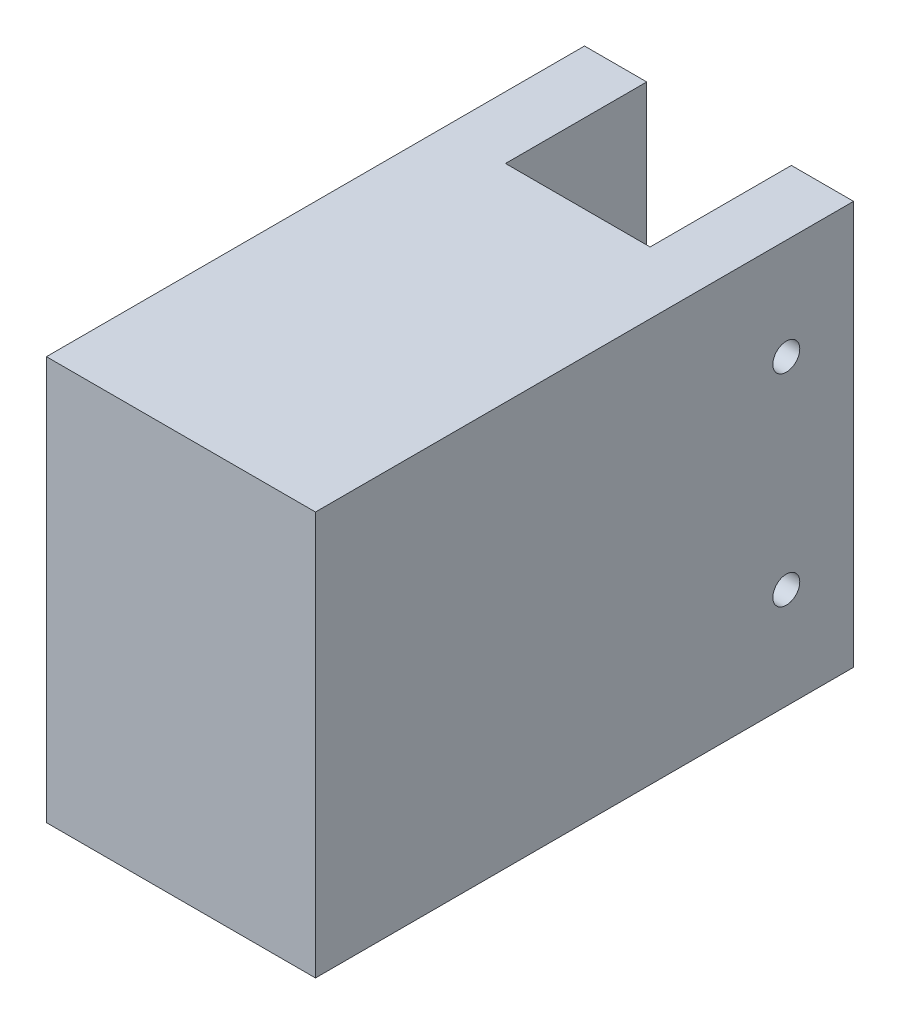
ISO-10303-21;
HEADER;
FILE_DESCRIPTION(('STEP AP214'),'2;1');
FILE_NAME('part.step','',(''),(''),'','','');
FILE_SCHEMA(('AUTOMOTIVE_DESIGN { 1 0 10303 214 1 1 1 1 }'));
ENDSEC;
DATA;
#1=APPLICATION_CONTEXT('core data for automotive mechanical design processes');
#2=APPLICATION_PROTOCOL_DEFINITION('international standard','automotive_design',2000,#1);
#3=PRODUCT_CONTEXT('',#1,'mechanical');
#4=PRODUCT('Part','Part','',(#3));
#5=PRODUCT_RELATED_PRODUCT_CATEGORY('part','',(#4));
#6=PRODUCT_DEFINITION_FORMATION('','',#4);
#7=PRODUCT_DEFINITION_CONTEXT('part definition',#1,'design');
#8=PRODUCT_DEFINITION('design','',#6,#7);
#9=PRODUCT_DEFINITION_SHAPE('','',#8);
#10=(LENGTH_UNIT() NAMED_UNIT(*) SI_UNIT(.MILLI.,.METRE.));
#11=(NAMED_UNIT(*) PLANE_ANGLE_UNIT() SI_UNIT($,.RADIAN.));
#12=(NAMED_UNIT(*) SI_UNIT($,.STERADIAN.) SOLID_ANGLE_UNIT());
#13=UNCERTAINTY_MEASURE_WITH_UNIT(LENGTH_MEASURE(1.E-05),#10,'distance_accuracy_value','');
#14=(GEOMETRIC_REPRESENTATION_CONTEXT(3) GLOBAL_UNCERTAINTY_ASSIGNED_CONTEXT((#13)) GLOBAL_UNIT_ASSIGNED_CONTEXT((#10,
#11,#12)) REPRESENTATION_CONTEXT('',''));
#15=CARTESIAN_POINT('',(0.,0.,0.));
#16=DIRECTION('',(0.,0.,1.));
#17=DIRECTION('',(1.,0.,0.));
#18=AXIS2_PLACEMENT_3D('',#15,#16,#17);
#19=CARTESIAN_POINT('',(40.,0.,0.));
#20=DIRECTION('',(-1.,0.,0.));
#21=DIRECTION('',(0.,0.,1.));
#22=AXIS2_PLACEMENT_3D('',#19,#20,#21);
#23=CYLINDRICAL_SURFACE('',#22,17.5);
#24=CARTESIAN_POINT('',(0.,0.,0.));
#25=DIRECTION('',(1.,0.,0.));
#26=DIRECTION('',(0.,0.,-1.));
#27=AXIS2_PLACEMENT_3D('',#24,#25,#26);
#28=CIRCLE('',#27,17.5);
#29=CARTESIAN_POINT('',(0.,0.,-17.5));
#30=VERTEX_POINT('',#29);
#31=EDGE_CURVE('E99',#30,#30,#28,.T.);
#32=ORIENTED_EDGE('',*,*,#31,.F.);
#33=EDGE_LOOP('',(#32));
#34=FACE_BOUND('',#33,.T.);
#35=CARTESIAN_POINT('',(25.,0.,0.));
#36=DIRECTION('',(1.,0.,0.));
#37=DIRECTION('',(0.,0.,-1.));
#38=AXIS2_PLACEMENT_3D('',#35,#36,#37);
#39=CIRCLE('',#38,17.5);
#40=CARTESIAN_POINT('',(25.,0.,-17.5));
#41=VERTEX_POINT('',#40);
#42=EDGE_CURVE('E135',#41,#41,#39,.T.);
#43=ORIENTED_EDGE('',*,*,#42,.T.);
#44=EDGE_LOOP('',(#43));
#45=FACE_BOUND('',#44,.T.);
#46=ADVANCED_FACE('F35',(#34,#45),#23,.F.);
#47=CARTESIAN_POINT('',(40.,0.,0.));
#48=DIRECTION('',(1.,0.,0.));
#49=DIRECTION('',(0.,0.,-1.));
#50=AXIS2_PLACEMENT_3D('',#47,#48,#49);
#51=PLANE('',#50);
#52=CARTESIAN_POINT('',(40.,-15.,-40.));
#53=DIRECTION('',(1.,0.,0.));
#54=DIRECTION('',(0.,0.,-1.));
#55=AXIS2_PLACEMENT_3D('',#52,#53,#54);
#56=CIRCLE('',#55,2.);
#57=CARTESIAN_POINT('',(40.,-15.,-42.));
#58=VERTEX_POINT('',#57);
#59=EDGE_CURVE('E151',#58,#58,#56,.T.);
#60=ORIENTED_EDGE('',*,*,#59,.F.);
#61=EDGE_LOOP('',(#60));
#62=FACE_BOUND('',#61,.T.);
#63=CARTESIAN_POINT('',(40.,15.,-40.));
#64=DIRECTION('',(1.,0.,0.));
#65=DIRECTION('',(0.,0.,1.));
#66=AXIS2_PLACEMENT_3D('',#63,#64,#65);
#67=CIRCLE('',#66,2.);
#68=CARTESIAN_POINT('',(40.,15.,-38.));
#69=VERTEX_POINT('',#68);
#70=EDGE_CURVE('E150',#69,#69,#67,.T.);
#71=ORIENTED_EDGE('',*,*,#70,.F.);
#72=EDGE_LOOP('',(#71));
#73=FACE_BOUND('',#72,.T.);
#74=DIRECTION('',(0.,-1.,0.));
#75=VECTOR('',#74,1.);
#76=CARTESIAN_POINT('',(40.,-30.,30.));
#77=LINE('',#76,#75);
#78=CARTESIAN_POINT('',(40.,30.,30.));
#79=VERTEX_POINT('',#78);
#80=CARTESIAN_POINT('',(40.,-30.,30.));
#81=VERTEX_POINT('',#80);
#82=EDGE_CURVE('E88',#79,#81,#77,.T.);
#83=ORIENTED_EDGE('',*,*,#82,.T.);
#84=DIRECTION('',(0.,0.,-1.));
#85=VECTOR('',#84,1.);
#86=CARTESIAN_POINT('',(40.,-30.,-30.));
#87=LINE('',#86,#85);
#88=CARTESIAN_POINT('',(40.,-30.,-50.));
#89=VERTEX_POINT('',#88);
#90=EDGE_CURVE('E164',#81,#89,#87,.T.);
#91=ORIENTED_EDGE('',*,*,#90,.T.);
#92=DIRECTION('',(0.,-1.,0.));
#93=VECTOR('',#92,1.);
#94=CARTESIAN_POINT('',(40.,30.,-50.));
#95=LINE('',#94,#93);
#96=CARTESIAN_POINT('',(40.,30.,-50.));
#97=VERTEX_POINT('',#96);
#98=EDGE_CURVE('E154',#97,#89,#95,.T.);
#99=ORIENTED_EDGE('',*,*,#98,.F.);
#100=DIRECTION('',(0.,0.,1.));
#101=VECTOR('',#100,1.);
#102=CARTESIAN_POINT('',(40.,30.,-30.));
#103=LINE('',#102,#101);
#104=EDGE_CURVE('E61',#97,#79,#103,.T.);
#105=ORIENTED_EDGE('',*,*,#104,.T.);
#106=EDGE_LOOP('',(#83,#91,#99,#105));
#107=FACE_BOUND('',#106,.T.);
#108=ADVANCED_FACE('F168',(#62,#73,#107),#51,.T.);
#109=CARTESIAN_POINT('',(0.,0.,0.));
#110=DIRECTION('',(1.,0.,0.));
#111=DIRECTION('',(0.,0.,-1.));
#112=AXIS2_PLACEMENT_3D('',#109,#110,#111);
#113=PLANE('',#112);
#114=CARTESIAN_POINT('',(0.,-15.,-40.));
#115=DIRECTION('',(1.,0.,0.));
#116=DIRECTION('',(0.,0.,-1.));
#117=AXIS2_PLACEMENT_3D('',#114,#115,#116);
#118=CIRCLE('',#117,2.);
#119=CARTESIAN_POINT('',(0.,-15.,-42.));
#120=VERTEX_POINT('',#119);
#121=EDGE_CURVE('E139',#120,#120,#118,.T.);
#122=ORIENTED_EDGE('',*,*,#121,.T.);
#123=EDGE_LOOP('',(#122));
#124=FACE_BOUND('',#123,.T.);
#125=CARTESIAN_POINT('',(0.,15.,-40.));
#126=DIRECTION('',(1.,0.,0.));
#127=DIRECTION('',(0.,0.,1.));
#128=AXIS2_PLACEMENT_3D('',#125,#126,#127);
#129=CIRCLE('',#128,2.);
#130=CARTESIAN_POINT('',(0.,15.,-38.));
#131=VERTEX_POINT('',#130);
#132=EDGE_CURVE('E138',#131,#131,#129,.T.);
#133=ORIENTED_EDGE('',*,*,#132,.T.);
#134=EDGE_LOOP('',(#133));
#135=FACE_BOUND('',#134,.T.);
#136=DIRECTION('',(0.,-1.,0.));
#137=VECTOR('',#136,1.);
#138=CARTESIAN_POINT('',(0.,-30.,30.));
#139=LINE('',#138,#137);
#140=CARTESIAN_POINT('',(0.,30.,30.));
#141=VERTEX_POINT('',#140);
#142=CARTESIAN_POINT('',(0.,-30.,30.));
#143=VERTEX_POINT('',#142);
#144=EDGE_CURVE('E94',#141,#143,#139,.T.);
#145=ORIENTED_EDGE('',*,*,#144,.F.);
#146=DIRECTION('',(0.,0.,1.));
#147=VECTOR('',#146,1.);
#148=CARTESIAN_POINT('',(0.,30.,-30.));
#149=LINE('',#148,#147);
#150=CARTESIAN_POINT('',(0.,30.,-50.));
#151=VERTEX_POINT('',#150);
#152=EDGE_CURVE('E75',#151,#141,#149,.T.);
#153=ORIENTED_EDGE('',*,*,#152,.F.);
#154=DIRECTION('',(0.,-1.,0.));
#155=VECTOR('',#154,1.);
#156=CARTESIAN_POINT('',(0.,30.,-50.));
#157=LINE('',#156,#155);
#158=CARTESIAN_POINT('',(0.,-30.,-50.));
#159=VERTEX_POINT('',#158);
#160=EDGE_CURVE('E142',#151,#159,#157,.T.);
#161=ORIENTED_EDGE('',*,*,#160,.T.);
#162=DIRECTION('',(0.,0.,-1.));
#163=VECTOR('',#162,1.);
#164=CARTESIAN_POINT('',(0.,-30.,-30.));
#165=LINE('',#164,#163);
#166=EDGE_CURVE('E89',#143,#159,#165,.T.);
#167=ORIENTED_EDGE('',*,*,#166,.F.);
#168=EDGE_LOOP('',(#145,#153,#161,#167));
#169=FACE_BOUND('',#168,.T.);
#170=ORIENTED_EDGE('',*,*,#31,.T.);
#171=EDGE_LOOP('',(#170));
#172=FACE_BOUND('',#171,.T.);
#173=ADVANCED_FACE('F96',(#124,#135,#169,#172),#113,.F.);
#174=CARTESIAN_POINT('',(40.,-30.,30.));
#175=DIRECTION('',(0.,0.,-1.));
#176=DIRECTION('',(-1.,0.,0.));
#177=AXIS2_PLACEMENT_3D('',#174,#175,#176);
#178=PLANE('',#177);
#179=ORIENTED_EDGE('',*,*,#144,.T.);
#180=DIRECTION('',(-1.,0.,0.));
#181=VECTOR('',#180,1.);
#182=CARTESIAN_POINT('',(40.,-30.,30.));
#183=LINE('',#182,#181);
#184=EDGE_CURVE('E11',#81,#143,#183,.T.);
#185=ORIENTED_EDGE('',*,*,#184,.F.);
#186=ORIENTED_EDGE('',*,*,#82,.F.);
#187=DIRECTION('',(-1.,0.,0.));
#188=VECTOR('',#187,1.);
#189=CARTESIAN_POINT('',(40.,30.,30.));
#190=LINE('',#189,#188);
#191=EDGE_CURVE('E44',#79,#141,#190,.T.);
#192=ORIENTED_EDGE('',*,*,#191,.T.);
#193=EDGE_LOOP('',(#179,#185,#186,#192));
#194=FACE_BOUND('',#193,.T.);
#195=ADVANCED_FACE('F37',(#194),#178,.F.);
#196=CARTESIAN_POINT('',(40.,-30.,-30.));
#197=DIRECTION('',(0.,1.,0.));
#198=DIRECTION('',(0.,0.,1.));
#199=AXIS2_PLACEMENT_3D('',#196,#197,#198);
#200=PLANE('',#199);
#201=DIRECTION('',(1.,0.,0.));
#202=VECTOR('',#201,1.);
#203=CARTESIAN_POINT('',(0.,-30.,-50.));
#204=LINE('',#203,#202);
#205=CARTESIAN_POINT('',(9.25,-30.,-50.));
#206=VERTEX_POINT('',#205);
#207=EDGE_CURVE('E147',#159,#206,#204,.T.);
#208=ORIENTED_EDGE('',*,*,#207,.T.);
#209=DIRECTION('',(0.,0.,1.));
#210=VECTOR('',#209,1.);
#211=CARTESIAN_POINT('',(9.25,-30.,-50.));
#212=LINE('',#211,#210);
#213=CARTESIAN_POINT('',(9.25,-30.,-29.));
#214=VERTEX_POINT('',#213);
#215=EDGE_CURVE('E52',#206,#214,#212,.T.);
#216=ORIENTED_EDGE('',*,*,#215,.T.);
#217=DIRECTION('',(1.,0.,0.));
#218=VECTOR('',#217,1.);
#219=CARTESIAN_POINT('',(9.25,-30.,-29.));
#220=LINE('',#219,#218);
#221=CARTESIAN_POINT('',(30.75,-30.,-29.));
#222=VERTEX_POINT('',#221);
#223=EDGE_CURVE('E374',#214,#222,#220,.T.);
#224=ORIENTED_EDGE('',*,*,#223,.T.);
#225=DIRECTION('',(0.,0.,-1.));
#226=VECTOR('',#225,1.);
#227=CARTESIAN_POINT('',(30.75,-30.,-50.));
#228=LINE('',#227,#226);
#229=CARTESIAN_POINT('',(30.75,-30.,-50.));
#230=VERTEX_POINT('',#229);
#231=EDGE_CURVE('E130',#222,#230,#228,.T.);
#232=ORIENTED_EDGE('',*,*,#231,.T.);
#233=DIRECTION('',(-1.,0.,0.));
#234=VECTOR('',#233,1.);
#235=CARTESIAN_POINT('',(40.,-30.,-50.));
#236=LINE('',#235,#234);
#237=EDGE_CURVE('E159',#89,#230,#236,.T.);
#238=ORIENTED_EDGE('',*,*,#237,.F.);
#239=ORIENTED_EDGE('',*,*,#90,.F.);
#240=ORIENTED_EDGE('',*,*,#184,.T.);
#241=ORIENTED_EDGE('',*,*,#166,.T.);
#242=EDGE_LOOP('',(#208,#216,#224,#232,#238,#239,#240,#241));
#243=FACE_BOUND('',#242,.T.);
#244=ADVANCED_FACE('F173',(#243),#200,.F.);
#245=CARTESIAN_POINT('',(40.,30.,-30.));
#246=DIRECTION('',(0.,-1.,0.));
#247=DIRECTION('',(0.,0.,-1.));
#248=AXIS2_PLACEMENT_3D('',#245,#246,#247);
#249=PLANE('',#248);
#250=DIRECTION('',(1.,0.,0.));
#251=VECTOR('',#250,1.);
#252=CARTESIAN_POINT('',(9.25,30.,-29.));
#253=LINE('',#252,#251);
#254=CARTESIAN_POINT('',(9.25,30.,-29.));
#255=VERTEX_POINT('',#254);
#256=CARTESIAN_POINT('',(30.75,30.,-29.));
#257=VERTEX_POINT('',#256);
#258=EDGE_CURVE('E367',#255,#257,#253,.T.);
#259=ORIENTED_EDGE('',*,*,#258,.F.);
#260=DIRECTION('',(0.,0.,1.));
#261=VECTOR('',#260,1.);
#262=CARTESIAN_POINT('',(9.25,30.,-50.));
#263=LINE('',#262,#261);
#264=CARTESIAN_POINT('',(9.25,30.,-50.));
#265=VERTEX_POINT('',#264);
#266=EDGE_CURVE('E370',#265,#255,#263,.T.);
#267=ORIENTED_EDGE('',*,*,#266,.F.);
#268=DIRECTION('',(-1.,0.,0.));
#269=VECTOR('',#268,1.);
#270=CARTESIAN_POINT('',(0.,30.,-50.));
#271=LINE('',#270,#269);
#272=EDGE_CURVE('E83',#265,#151,#271,.T.);
#273=ORIENTED_EDGE('',*,*,#272,.T.);
#274=ORIENTED_EDGE('',*,*,#152,.T.);
#275=ORIENTED_EDGE('',*,*,#191,.F.);
#276=ORIENTED_EDGE('',*,*,#104,.F.);
#277=DIRECTION('',(1.,0.,0.));
#278=VECTOR('',#277,1.);
#279=CARTESIAN_POINT('',(40.,30.,-50.));
#280=LINE('',#279,#278);
#281=CARTESIAN_POINT('',(30.75,30.,-50.));
#282=VERTEX_POINT('',#281);
#283=EDGE_CURVE('E103',#282,#97,#280,.T.);
#284=ORIENTED_EDGE('',*,*,#283,.F.);
#285=DIRECTION('',(0.,0.,-1.));
#286=VECTOR('',#285,1.);
#287=CARTESIAN_POINT('',(30.75,30.,-50.));
#288=LINE('',#287,#286);
#289=EDGE_CURVE('E123',#257,#282,#288,.T.);
#290=ORIENTED_EDGE('',*,*,#289,.F.);
#291=EDGE_LOOP('',(#259,#267,#273,#274,#275,#276,#284,#290));
#292=FACE_BOUND('',#291,.T.);
#293=ADVANCED_FACE('F78',(#292),#249,.F.);
#294=CARTESIAN_POINT('',(0.,0.,-50.));
#295=DIRECTION('',(0.,0.,-1.));
#296=DIRECTION('',(-1.,0.,0.));
#297=AXIS2_PLACEMENT_3D('',#294,#295,#296);
#298=PLANE('',#297);
#299=DIRECTION('',(0.,1.,0.));
#300=VECTOR('',#299,1.);
#301=CARTESIAN_POINT('',(30.75,-30.,-50.));
#302=LINE('',#301,#300);
#303=EDGE_CURVE('E115',#230,#282,#302,.T.);
#304=ORIENTED_EDGE('',*,*,#303,.T.);
#305=ORIENTED_EDGE('',*,*,#283,.T.);
#306=ORIENTED_EDGE('',*,*,#98,.T.);
#307=ORIENTED_EDGE('',*,*,#237,.T.);
#308=EDGE_LOOP('',(#304,#305,#306,#307));
#309=FACE_BOUND('',#308,.T.);
#310=ADVANCED_FACE('F178',(#309),#298,.T.);
#311=CARTESIAN_POINT('',(0.,15.,-40.));
#312=DIRECTION('',(1.,0.,0.));
#313=DIRECTION('',(0.,0.,-1.));
#314=AXIS2_PLACEMENT_3D('',#311,#312,#313);
#315=CYLINDRICAL_SURFACE('',#314,2.);
#316=CARTESIAN_POINT('',(30.75,15.,-40.));
#317=DIRECTION('',(1.,0.,0.));
#318=DIRECTION('',(0.,0.,-1.));
#319=AXIS2_PLACEMENT_3D('',#316,#317,#318);
#320=CIRCLE('',#319,2.);
#321=CARTESIAN_POINT('',(30.75,15.,-42.));
#322=VERTEX_POINT('',#321);
#323=EDGE_CURVE('E132',#322,#322,#320,.F.);
#324=ORIENTED_EDGE('',*,*,#323,.T.);
#325=EDGE_LOOP('',(#324));
#326=FACE_BOUND('',#325,.T.);
#327=ORIENTED_EDGE('',*,*,#70,.T.);
#328=EDGE_LOOP('',(#327));
#329=FACE_BOUND('',#328,.T.);
#330=ADVANCED_FACE('F208',(#326,#329),#315,.F.);
#331=CARTESIAN_POINT('',(0.,-15.,-40.));
#332=DIRECTION('',(1.,0.,0.));
#333=DIRECTION('',(0.,0.,-1.));
#334=AXIS2_PLACEMENT_3D('',#331,#332,#333);
#335=CYLINDRICAL_SURFACE('',#334,2.);
#336=CARTESIAN_POINT('',(30.75,-15.,-40.));
#337=DIRECTION('',(1.,0.,0.));
#338=DIRECTION('',(0.,0.,-1.));
#339=AXIS2_PLACEMENT_3D('',#336,#337,#338);
#340=CIRCLE('',#339,2.);
#341=CARTESIAN_POINT('',(30.75,-15.,-42.));
#342=VERTEX_POINT('',#341);
#343=EDGE_CURVE('E39',#342,#342,#340,.F.);
#344=ORIENTED_EDGE('',*,*,#343,.T.);
#345=EDGE_LOOP('',(#344));
#346=FACE_BOUND('',#345,.T.);
#347=ORIENTED_EDGE('',*,*,#59,.T.);
#348=EDGE_LOOP('',(#347));
#349=FACE_BOUND('',#348,.T.);
#350=ADVANCED_FACE('F199',(#346,#349),#335,.F.);
#351=CARTESIAN_POINT('',(40.,0.,-50.));
#352=DIRECTION('',(0.,0.,-1.));
#353=DIRECTION('',(1.,0.,0.));
#354=AXIS2_PLACEMENT_3D('',#351,#352,#353);
#355=PLANE('',#354);
#356=DIRECTION('',(0.,1.,0.));
#357=VECTOR('',#356,1.);
#358=CARTESIAN_POINT('',(9.25,-30.,-50.));
#359=LINE('',#358,#357);
#360=EDGE_CURVE('E110',#206,#265,#359,.T.);
#361=ORIENTED_EDGE('',*,*,#360,.F.);
#362=ORIENTED_EDGE('',*,*,#207,.F.);
#363=ORIENTED_EDGE('',*,*,#160,.F.);
#364=ORIENTED_EDGE('',*,*,#272,.F.);
#365=EDGE_LOOP('',(#361,#362,#363,#364));
#366=FACE_BOUND('',#365,.T.);
#367=ADVANCED_FACE('F196',(#366),#355,.T.);
#368=CARTESIAN_POINT('',(40.,15.,-40.));
#369=DIRECTION('',(-1.,0.,0.));
#370=DIRECTION('',(0.,0.,1.));
#371=AXIS2_PLACEMENT_3D('',#368,#369,#370);
#372=CYLINDRICAL_SURFACE('',#371,2.);
#373=CARTESIAN_POINT('',(9.25,15.,-40.));
#374=DIRECTION('',(-1.,0.,0.));
#375=DIRECTION('',(0.,0.,1.));
#376=AXIS2_PLACEMENT_3D('',#373,#374,#375);
#377=CIRCLE('',#376,2.);
#378=CARTESIAN_POINT('',(9.25,15.,-38.));
#379=VERTEX_POINT('',#378);
#380=EDGE_CURVE('E109',#379,#379,#377,.T.);
#381=ORIENTED_EDGE('',*,*,#380,.F.);
#382=EDGE_LOOP('',(#381));
#383=FACE_BOUND('',#382,.T.);
#384=ORIENTED_EDGE('',*,*,#132,.F.);
#385=EDGE_LOOP('',(#384));
#386=FACE_BOUND('',#385,.T.);
#387=ADVANCED_FACE('F198',(#383,#386),#372,.F.);
#388=CARTESIAN_POINT('',(40.,-15.,-40.));
#389=DIRECTION('',(-1.,0.,0.));
#390=DIRECTION('',(0.,0.,1.));
#391=AXIS2_PLACEMENT_3D('',#388,#389,#390);
#392=CYLINDRICAL_SURFACE('',#391,2.);
#393=CARTESIAN_POINT('',(9.25,-15.,-40.));
#394=DIRECTION('',(-1.,0.,0.));
#395=DIRECTION('',(0.,0.,1.));
#396=AXIS2_PLACEMENT_3D('',#393,#394,#395);
#397=CIRCLE('',#396,2.);
#398=CARTESIAN_POINT('',(9.25,-15.,-38.));
#399=VERTEX_POINT('',#398);
#400=EDGE_CURVE('E107',#399,#399,#397,.T.);
#401=ORIENTED_EDGE('',*,*,#400,.F.);
#402=EDGE_LOOP('',(#401));
#403=FACE_BOUND('',#402,.T.);
#404=ORIENTED_EDGE('',*,*,#121,.F.);
#405=EDGE_LOOP('',(#404));
#406=FACE_BOUND('',#405,.T.);
#407=ADVANCED_FACE('F205',(#403,#406),#392,.F.);
#408=CARTESIAN_POINT('',(25.,0.,0.));
#409=DIRECTION('',(1.,0.,0.));
#410=DIRECTION('',(0.,0.,-1.));
#411=AXIS2_PLACEMENT_3D('',#408,#409,#410);
#412=PLANE('',#411);
#413=ORIENTED_EDGE('',*,*,#42,.F.);
#414=EDGE_LOOP('',(#413));
#415=FACE_BOUND('',#414,.T.);
#416=ADVANCED_FACE('F289',(#415),#412,.F.);
#417=CARTESIAN_POINT('',(30.75,-30.,-50.));
#418=DIRECTION('',(1.,0.,0.));
#419=DIRECTION('',(0.,0.,-1.));
#420=AXIS2_PLACEMENT_3D('',#417,#418,#419);
#421=PLANE('',#420);
#422=ORIENTED_EDGE('',*,*,#343,.F.);
#423=EDGE_LOOP('',(#422));
#424=FACE_BOUND('',#423,.T.);
#425=ORIENTED_EDGE('',*,*,#289,.T.);
#426=ORIENTED_EDGE('',*,*,#303,.F.);
#427=ORIENTED_EDGE('',*,*,#231,.F.);
#428=DIRECTION('',(0.,1.,0.));
#429=VECTOR('',#428,1.);
#430=CARTESIAN_POINT('',(30.75,-30.,-29.));
#431=LINE('',#430,#429);
#432=EDGE_CURVE('E120',#222,#257,#431,.T.);
#433=ORIENTED_EDGE('',*,*,#432,.T.);
#434=EDGE_LOOP('',(#425,#426,#427,#433));
#435=FACE_BOUND('',#434,.T.);
#436=ORIENTED_EDGE('',*,*,#323,.F.);
#437=EDGE_LOOP('',(#436));
#438=FACE_BOUND('',#437,.T.);
#439=ADVANCED_FACE('F305',(#424,#435,#438),#421,.F.);
#440=CARTESIAN_POINT('',(9.25,-30.,-50.));
#441=DIRECTION('',(-1.,0.,0.));
#442=DIRECTION('',(0.,0.,1.));
#443=AXIS2_PLACEMENT_3D('',#440,#441,#442);
#444=PLANE('',#443);
#445=ORIENTED_EDGE('',*,*,#380,.T.);
#446=EDGE_LOOP('',(#445));
#447=FACE_BOUND('',#446,.T.);
#448=ORIENTED_EDGE('',*,*,#400,.T.);
#449=EDGE_LOOP('',(#448));
#450=FACE_BOUND('',#449,.T.);
#451=ORIENTED_EDGE('',*,*,#266,.T.);
#452=DIRECTION('',(0.,1.,0.));
#453=VECTOR('',#452,1.);
#454=CARTESIAN_POINT('',(9.25,-30.,-29.));
#455=LINE('',#454,#453);
#456=EDGE_CURVE('E128',#214,#255,#455,.T.);
#457=ORIENTED_EDGE('',*,*,#456,.F.);
#458=ORIENTED_EDGE('',*,*,#215,.F.);
#459=ORIENTED_EDGE('',*,*,#360,.T.);
#460=EDGE_LOOP('',(#451,#457,#458,#459));
#461=FACE_BOUND('',#460,.T.);
#462=ADVANCED_FACE('F312',(#447,#450,#461),#444,.F.);
#463=CARTESIAN_POINT('',(9.25,-30.,-29.));
#464=DIRECTION('',(0.,0.,1.));
#465=DIRECTION('',(0.,-1.,0.));
#466=AXIS2_PLACEMENT_3D('',#463,#464,#465);
#467=PLANE('',#466);
#468=ORIENTED_EDGE('',*,*,#258,.T.);
#469=ORIENTED_EDGE('',*,*,#432,.F.);
#470=ORIENTED_EDGE('',*,*,#223,.F.);
#471=ORIENTED_EDGE('',*,*,#456,.T.);
#472=EDGE_LOOP('',(#468,#469,#470,#471));
#473=FACE_BOUND('',#472,.T.);
#474=ADVANCED_FACE('F320',(#473),#467,.F.);
#475=CLOSED_SHELL('',(#46,#108,#173,#195,#244,#293,#310,#330,#350,#367,#387,#407,#416,#439,#462,#474));
#476=MANIFOLD_SOLID_BREP('B2',#475);
#477=ADVANCED_BREP_SHAPE_REPRESENTATION('',(#18,#476),#14);
#478=SHAPE_DEFINITION_REPRESENTATION(#9,#477);
ENDSEC;
END-ISO-10303-21;
